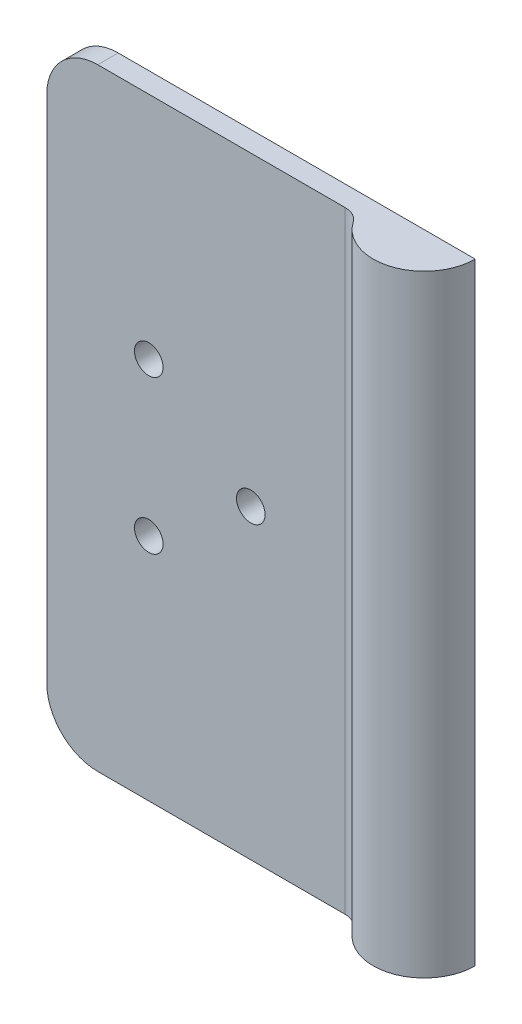
ISO-10303-21;
HEADER;
FILE_DESCRIPTION(('STEP AP214'),'2;1');
FILE_NAME('part.step','',(''),(''),'','','');
FILE_SCHEMA(('AUTOMOTIVE_DESIGN { 1 0 10303 214 1 1 1 1 }'));
ENDSEC;
DATA;
#1=APPLICATION_CONTEXT('core data for automotive mechanical design processes');
#2=APPLICATION_PROTOCOL_DEFINITION('international standard','automotive_design',2000,#1);
#3=PRODUCT_CONTEXT('',#1,'mechanical');
#4=PRODUCT('Part','Part','',(#3));
#5=PRODUCT_RELATED_PRODUCT_CATEGORY('part','',(#4));
#6=PRODUCT_DEFINITION_FORMATION('','',#4);
#7=PRODUCT_DEFINITION_CONTEXT('part definition',#1,'design');
#8=PRODUCT_DEFINITION('design','',#6,#7);
#9=PRODUCT_DEFINITION_SHAPE('','',#8);
#10=(LENGTH_UNIT() NAMED_UNIT(*) SI_UNIT(.MILLI.,.METRE.));
#11=(NAMED_UNIT(*) PLANE_ANGLE_UNIT() SI_UNIT($,.RADIAN.));
#12=(NAMED_UNIT(*) SI_UNIT($,.STERADIAN.) SOLID_ANGLE_UNIT());
#13=UNCERTAINTY_MEASURE_WITH_UNIT(LENGTH_MEASURE(1.E-05),#10,'distance_accuracy_value','');
#14=(GEOMETRIC_REPRESENTATION_CONTEXT(3) GLOBAL_UNCERTAINTY_ASSIGNED_CONTEXT((#13)) GLOBAL_UNIT_ASSIGNED_CONTEXT((#10,
#11,#12)) REPRESENTATION_CONTEXT('',''));
#15=CARTESIAN_POINT('',(0.,0.,0.));
#16=DIRECTION('',(0.,0.,1.));
#17=DIRECTION('',(1.,0.,0.));
#18=AXIS2_PLACEMENT_3D('',#15,#16,#17);
#19=CARTESIAN_POINT('',(-60.9850692997892,21.8064344030394,0.));
#20=DIRECTION('',(0.,0.,-1.));
#21=DIRECTION('',(-1.,0.,0.));
#22=AXIS2_PLACEMENT_3D('',#19,#20,#21);
#23=PLANE('',#22);
#24=CARTESIAN_POINT('',(-55.9850692997892,4.30643440303937,0.));
#25=DIRECTION('',(0.,0.,-1.));
#26=DIRECTION('',(1.,0.,0.));
#27=AXIS2_PLACEMENT_3D('',#24,#25,#26);
#28=CIRCLE('',#27,1.4);
#29=CARTESIAN_POINT('',(-54.5850692997892,4.30643440303937,0.));
#30=VERTEX_POINT('',#29);
#31=EDGE_CURVE('E159',#30,#30,#28,.T.);
#32=ORIENTED_EDGE('',*,*,#31,.T.);
#33=EDGE_LOOP('',(#32));
#34=FACE_BOUND('',#33,.T.);
#35=CARTESIAN_POINT('',(-55.9850692997892,-10.6935655969606,0.));
#36=DIRECTION('',(0.,0.,-1.));
#37=DIRECTION('',(1.,0.,0.));
#38=AXIS2_PLACEMENT_3D('',#35,#36,#37);
#39=CIRCLE('',#38,1.4);
#40=CARTESIAN_POINT('',(-54.5850692997892,-10.6935655969606,0.));
#41=VERTEX_POINT('',#40);
#42=EDGE_CURVE('E167',#41,#41,#39,.T.);
#43=ORIENTED_EDGE('',*,*,#42,.T.);
#44=EDGE_LOOP('',(#43));
#45=FACE_BOUND('',#44,.T.);
#46=CARTESIAN_POINT('',(-45.9850692997892,-3.19356559696063,0.));
#47=DIRECTION('',(0.,0.,-1.));
#48=DIRECTION('',(1.,0.,0.));
#49=AXIS2_PLACEMENT_3D('',#46,#47,#48);
#50=CIRCLE('',#49,1.4);
#51=CARTESIAN_POINT('',(-44.5850692997892,-3.19356559696063,0.));
#52=VERTEX_POINT('',#51);
#53=EDGE_CURVE('E172',#52,#52,#50,.T.);
#54=ORIENTED_EDGE('',*,*,#53,.T.);
#55=EDGE_LOOP('',(#54));
#56=FACE_BOUND('',#55,.T.);
#57=DIRECTION('',(-1.,0.,0.));
#58=VECTOR('',#57,1.);
#59=CARTESIAN_POINT('',(-30.9850692997892,-33.1935655969606,0.));
#60=LINE('',#59,#58);
#61=CARTESIAN_POINT('',(-36.7296319463273,-33.1935655969606,0.));
#62=VERTEX_POINT('',#61);
#63=CARTESIAN_POINT('',(-60.9850692997892,-33.1935655969606,0.));
#64=VERTEX_POINT('',#63);
#65=EDGE_CURVE('E145',#62,#64,#60,.T.);
#66=ORIENTED_EDGE('',*,*,#65,.F.);
#67=DIRECTION('',(0.,1.,0.));
#68=VECTOR('',#67,1.);
#69=CARTESIAN_POINT('',(-36.7296319463273,21.8064344030394,0.));
#70=LINE('',#69,#68);
#71=CARTESIAN_POINT('',(-36.7296319463273,26.8064344030394,0.));
#72=VERTEX_POINT('',#71);
#73=EDGE_CURVE('E128',#62,#72,#70,.T.);
#74=ORIENTED_EDGE('',*,*,#73,.T.);
#75=DIRECTION('',(1.,0.,0.));
#76=VECTOR('',#75,1.);
#77=CARTESIAN_POINT('',(-60.9850692997892,26.8064344030394,0.));
#78=LINE('',#77,#76);
#79=CARTESIAN_POINT('',(-60.9850692997892,26.8064344030394,0.));
#80=VERTEX_POINT('',#79);
#81=EDGE_CURVE('E142',#80,#72,#78,.T.);
#82=ORIENTED_EDGE('',*,*,#81,.F.);
#83=CARTESIAN_POINT('',(-60.9850692997892,21.8064344030394,0.));
#84=DIRECTION('',(0.,0.,-1.));
#85=DIRECTION('',(-1.,0.,0.));
#86=AXIS2_PLACEMENT_3D('',#83,#84,#85);
#87=CIRCLE('',#86,5.);
#88=CARTESIAN_POINT('',(-65.9850692997892,21.8064344030394,0.));
#89=VERTEX_POINT('',#88);
#90=EDGE_CURVE('E125',#89,#80,#87,.T.);
#91=ORIENTED_EDGE('',*,*,#90,.F.);
#92=DIRECTION('',(0.,1.,0.));
#93=VECTOR('',#92,1.);
#94=CARTESIAN_POINT('',(-65.9850692997892,-28.1935655969607,0.));
#95=LINE('',#94,#93);
#96=CARTESIAN_POINT('',(-65.9850692997892,-28.1935655969607,0.));
#97=VERTEX_POINT('',#96);
#98=EDGE_CURVE('E134',#97,#89,#95,.T.);
#99=ORIENTED_EDGE('',*,*,#98,.F.);
#100=CARTESIAN_POINT('',(-60.9850692997892,-28.1935655969607,0.));
#101=DIRECTION('',(0.,0.,-1.));
#102=DIRECTION('',(-1.,0.,0.));
#103=AXIS2_PLACEMENT_3D('',#100,#101,#102);
#104=CIRCLE('',#103,5.);
#105=EDGE_CURVE('E149',#64,#97,#104,.T.);
#106=ORIENTED_EDGE('',*,*,#105,.F.);
#107=EDGE_LOOP('',(#66,#74,#82,#91,#99,#106));
#108=FACE_BOUND('',#107,.T.);
#109=ADVANCED_FACE('F37',(#34,#45,#56,#108),#23,.F.);
#110=CARTESIAN_POINT('',(-60.9850692997892,21.8064344030394,0.));
#111=DIRECTION('',(0.,0.,-1.));
#112=DIRECTION('',(-1.,0.,0.));
#113=AXIS2_PLACEMENT_3D('',#110,#111,#112);
#114=CYLINDRICAL_SURFACE('',#113,5.);
#115=CARTESIAN_POINT('',(-60.9850692997892,21.8064344030394,-2.));
#116=DIRECTION('',(0.,0.,-1.));
#117=DIRECTION('',(-1.,0.,0.));
#118=AXIS2_PLACEMENT_3D('',#115,#116,#117);
#119=CIRCLE('',#118,5.);
#120=CARTESIAN_POINT('',(-65.9850692997892,21.8064344030394,-2.));
#121=VERTEX_POINT('',#120);
#122=CARTESIAN_POINT('',(-60.9850692997892,26.8064344030394,-2.));
#123=VERTEX_POINT('',#122);
#124=EDGE_CURVE('E158',#121,#123,#119,.T.);
#125=ORIENTED_EDGE('',*,*,#124,.F.);
#126=DIRECTION('',(0.,0.,-1.));
#127=VECTOR('',#126,1.);
#128=CARTESIAN_POINT('',(-65.9850692997892,21.8064344030394,0.));
#129=LINE('',#128,#127);
#130=EDGE_CURVE('E126',#89,#121,#129,.T.);
#131=ORIENTED_EDGE('',*,*,#130,.F.);
#132=ORIENTED_EDGE('',*,*,#90,.T.);
#133=DIRECTION('',(0.,0.,-1.));
#134=VECTOR('',#133,1.);
#135=CARTESIAN_POINT('',(-60.9850692997892,26.8064344030394,0.));
#136=LINE('',#135,#134);
#137=EDGE_CURVE('E132',#80,#123,#136,.T.);
#138=ORIENTED_EDGE('',*,*,#137,.T.);
#139=EDGE_LOOP('',(#125,#131,#132,#138));
#140=FACE_BOUND('',#139,.T.);
#141=ADVANCED_FACE('F186',(#140),#114,.T.);
#142=CARTESIAN_POINT('',(-65.9850692997892,-28.1935655969607,0.));
#143=DIRECTION('',(-1.,0.,0.));
#144=DIRECTION('',(0.,0.,1.));
#145=AXIS2_PLACEMENT_3D('',#142,#143,#144);
#146=PLANE('',#145);
#147=DIRECTION('',(0.,1.,0.));
#148=VECTOR('',#147,1.);
#149=CARTESIAN_POINT('',(-65.9850692997892,-28.1935655969607,-2.));
#150=LINE('',#149,#148);
#151=CARTESIAN_POINT('',(-65.9850692997892,-28.1935655969607,-2.));
#152=VERTEX_POINT('',#151);
#153=EDGE_CURVE('E119',#152,#121,#150,.T.);
#154=ORIENTED_EDGE('',*,*,#153,.F.);
#155=DIRECTION('',(0.,0.,-1.));
#156=VECTOR('',#155,1.);
#157=CARTESIAN_POINT('',(-65.9850692997892,-28.1935655969607,0.));
#158=LINE('',#157,#156);
#159=EDGE_CURVE('E129',#97,#152,#158,.T.);
#160=ORIENTED_EDGE('',*,*,#159,.F.);
#161=ORIENTED_EDGE('',*,*,#98,.T.);
#162=ORIENTED_EDGE('',*,*,#130,.T.);
#163=EDGE_LOOP('',(#154,#160,#161,#162));
#164=FACE_BOUND('',#163,.T.);
#165=ADVANCED_FACE('F184',(#164),#146,.T.);
#166=CARTESIAN_POINT('',(-60.9850692997892,-28.1935655969607,0.));
#167=DIRECTION('',(0.,0.,-1.));
#168=DIRECTION('',(-1.,0.,0.));
#169=AXIS2_PLACEMENT_3D('',#166,#167,#168);
#170=CYLINDRICAL_SURFACE('',#169,5.);
#171=CARTESIAN_POINT('',(-60.9850692997892,-28.1935655969607,-2.));
#172=DIRECTION('',(0.,0.,-1.));
#173=DIRECTION('',(-1.,0.,0.));
#174=AXIS2_PLACEMENT_3D('',#171,#172,#173);
#175=CIRCLE('',#174,5.);
#176=CARTESIAN_POINT('',(-60.9850692997892,-33.1935655969606,-2.));
#177=VERTEX_POINT('',#176);
#178=EDGE_CURVE('E117',#177,#152,#175,.T.);
#179=ORIENTED_EDGE('',*,*,#178,.F.);
#180=DIRECTION('',(0.,0.,-1.));
#181=VECTOR('',#180,1.);
#182=CARTESIAN_POINT('',(-60.9850692997892,-33.1935655969606,0.));
#183=LINE('',#182,#181);
#184=EDGE_CURVE('E115',#64,#177,#183,.T.);
#185=ORIENTED_EDGE('',*,*,#184,.F.);
#186=ORIENTED_EDGE('',*,*,#105,.T.);
#187=ORIENTED_EDGE('',*,*,#159,.T.);
#188=EDGE_LOOP('',(#179,#185,#186,#187));
#189=FACE_BOUND('',#188,.T.);
#190=ADVANCED_FACE('F180',(#189),#170,.T.);
#191=CARTESIAN_POINT('',(-30.9850692997892,-33.1935655969606,0.));
#192=DIRECTION('',(0.,-1.,0.));
#193=DIRECTION('',(0.,0.,-1.));
#194=AXIS2_PLACEMENT_3D('',#191,#192,#193);
#195=PLANE('',#194);
#196=ORIENTED_EDGE('',*,*,#184,.T.);
#197=DIRECTION('',(-1.,0.,0.));
#198=VECTOR('',#197,1.);
#199=CARTESIAN_POINT('',(-30.9850692997892,-33.1935655969606,-2.));
#200=LINE('',#199,#198);
#201=CARTESIAN_POINT('',(-25.9850692997892,-33.1935655969607,-2.));
#202=VERTEX_POINT('',#201);
#203=EDGE_CURVE('E107',#202,#177,#200,.T.);
#204=ORIENTED_EDGE('',*,*,#203,.F.);
#205=CARTESIAN_POINT('',(-30.9850692997892,-33.1935655969607,-2.));
#206=DIRECTION('',(0.,1.,0.));
#207=DIRECTION('',(0.,0.,1.));
#208=AXIS2_PLACEMENT_3D('',#205,#206,#207);
#209=CIRCLE('',#208,5.);
#210=CARTESIAN_POINT('',(-35.0883283330307,-33.1935655969607,0.857142857142855));
#211=VERTEX_POINT('',#210);
#212=EDGE_CURVE('E92',#211,#202,#209,.T.);
#213=ORIENTED_EDGE('',*,*,#212,.F.);
#214=CARTESIAN_POINT('',(-36.7296319463273,-33.1935655969606,2.));
#215=DIRECTION('',(0.,-1.,0.));
#216=DIRECTION('',(0.,0.,-1.));
#217=AXIS2_PLACEMENT_3D('',#214,#215,#216);
#218=CIRCLE('',#217,2.);
#219=EDGE_CURVE('E11',#211,#62,#218,.F.);
#220=ORIENTED_EDGE('',*,*,#219,.T.);
#221=ORIENTED_EDGE('',*,*,#65,.T.);
#222=EDGE_LOOP('',(#196,#204,#213,#220,#221));
#223=FACE_BOUND('',#222,.T.);
#224=ADVANCED_FACE('F113',(#223),#195,.T.);
#225=CARTESIAN_POINT('',(-60.9850692997892,26.8064344030394,0.));
#226=DIRECTION('',(0.,1.,0.));
#227=DIRECTION('',(0.,0.,1.));
#228=AXIS2_PLACEMENT_3D('',#225,#226,#227);
#229=PLANE('',#228);
#230=ORIENTED_EDGE('',*,*,#81,.T.);
#231=CARTESIAN_POINT('',(-36.7296319463273,26.8064344030394,2.));
#232=DIRECTION('',(0.,1.,0.));
#233=DIRECTION('',(0.,0.,1.));
#234=AXIS2_PLACEMENT_3D('',#231,#232,#233);
#235=CIRCLE('',#234,2.);
#236=CARTESIAN_POINT('',(-35.0883283330307,26.8064344030394,0.857142857142855));
#237=VERTEX_POINT('',#236);
#238=EDGE_CURVE('E45',#72,#237,#235,.F.);
#239=ORIENTED_EDGE('',*,*,#238,.T.);
#240=CARTESIAN_POINT('',(-30.9850692997892,26.8064344030394,-2.));
#241=DIRECTION('',(0.,1.,0.));
#242=DIRECTION('',(0.,0.,1.));
#243=AXIS2_PLACEMENT_3D('',#240,#241,#242);
#244=CIRCLE('',#243,5.);
#245=CARTESIAN_POINT('',(-25.9850692997892,26.8064344030394,-2.));
#246=VERTEX_POINT('',#245);
#247=EDGE_CURVE('E101',#237,#246,#244,.T.);
#248=ORIENTED_EDGE('',*,*,#247,.T.);
#249=DIRECTION('',(1.,0.,0.));
#250=VECTOR('',#249,1.);
#251=CARTESIAN_POINT('',(-60.9850692997892,26.8064344030394,-2.));
#252=LINE('',#251,#250);
#253=EDGE_CURVE('E111',#123,#246,#252,.T.);
#254=ORIENTED_EDGE('',*,*,#253,.F.);
#255=ORIENTED_EDGE('',*,*,#137,.F.);
#256=EDGE_LOOP('',(#230,#239,#248,#254,#255));
#257=FACE_BOUND('',#256,.T.);
#258=ADVANCED_FACE('F147',(#257),#229,.T.);
#259=CARTESIAN_POINT('',(-60.9850692997892,21.8064344030394,-2.));
#260=DIRECTION('',(0.,0.,-1.));
#261=DIRECTION('',(-1.,0.,0.));
#262=AXIS2_PLACEMENT_3D('',#259,#260,#261);
#263=PLANE('',#262);
#264=ORIENTED_EDGE('',*,*,#253,.T.);
#265=DIRECTION('',(0.,-1.,0.));
#266=VECTOR('',#265,1.);
#267=CARTESIAN_POINT('',(-25.9850692997892,21.8064344030394,-2.));
#268=LINE('',#267,#266);
#269=EDGE_CURVE('E95',#246,#202,#268,.T.);
#270=ORIENTED_EDGE('',*,*,#269,.T.);
#271=ORIENTED_EDGE('',*,*,#203,.T.);
#272=ORIENTED_EDGE('',*,*,#178,.T.);
#273=ORIENTED_EDGE('',*,*,#153,.T.);
#274=ORIENTED_EDGE('',*,*,#124,.T.);
#275=EDGE_LOOP('',(#264,#270,#271,#272,#273,#274));
#276=FACE_BOUND('',#275,.T.);
#277=CARTESIAN_POINT('',(-45.9850692997892,-3.19356559696063,-2.));
#278=DIRECTION('',(0.,0.,-1.));
#279=DIRECTION('',(1.,0.,0.));
#280=AXIS2_PLACEMENT_3D('',#277,#278,#279);
#281=CIRCLE('',#280,1.4);
#282=CARTESIAN_POINT('',(-44.5850692997892,-3.19356559696063,-2.));
#283=VERTEX_POINT('',#282);
#284=EDGE_CURVE('E100',#283,#283,#281,.T.);
#285=ORIENTED_EDGE('',*,*,#284,.F.);
#286=EDGE_LOOP('',(#285));
#287=FACE_BOUND('',#286,.T.);
#288=CARTESIAN_POINT('',(-55.9850692997892,-10.6935655969606,-2.));
#289=DIRECTION('',(0.,0.,-1.));
#290=DIRECTION('',(1.,0.,0.));
#291=AXIS2_PLACEMENT_3D('',#288,#289,#290);
#292=CIRCLE('',#291,1.4);
#293=CARTESIAN_POINT('',(-54.5850692997892,-10.6935655969606,-2.));
#294=VERTEX_POINT('',#293);
#295=EDGE_CURVE('E169',#294,#294,#292,.T.);
#296=ORIENTED_EDGE('',*,*,#295,.F.);
#297=EDGE_LOOP('',(#296));
#298=FACE_BOUND('',#297,.T.);
#299=CARTESIAN_POINT('',(-55.9850692997892,4.30643440303937,-2.));
#300=DIRECTION('',(0.,0.,-1.));
#301=DIRECTION('',(1.,0.,0.));
#302=AXIS2_PLACEMENT_3D('',#299,#300,#301);
#303=CIRCLE('',#302,1.4);
#304=CARTESIAN_POINT('',(-54.5850692997892,4.30643440303937,-2.));
#305=VERTEX_POINT('',#304);
#306=EDGE_CURVE('E162',#305,#305,#303,.T.);
#307=ORIENTED_EDGE('',*,*,#306,.F.);
#308=EDGE_LOOP('',(#307));
#309=FACE_BOUND('',#308,.T.);
#310=ADVANCED_FACE('F104',(#276,#287,#298,#309),#263,.T.);
#311=CARTESIAN_POINT('',(-55.9850692997892,4.30643440303937,0.));
#312=DIRECTION('',(0.,0.,-1.));
#313=DIRECTION('',(-1.,0.,0.));
#314=AXIS2_PLACEMENT_3D('',#311,#312,#313);
#315=CYLINDRICAL_SURFACE('',#314,1.4);
#316=ORIENTED_EDGE('',*,*,#31,.F.);
#317=EDGE_LOOP('',(#316));
#318=FACE_BOUND('',#317,.T.);
#319=ORIENTED_EDGE('',*,*,#306,.T.);
#320=EDGE_LOOP('',(#319));
#321=FACE_BOUND('',#320,.T.);
#322=ADVANCED_FACE('F202',(#318,#321),#315,.F.);
#323=CARTESIAN_POINT('',(-55.9850692997892,-10.6935655969606,0.));
#324=DIRECTION('',(0.,0.,-1.));
#325=DIRECTION('',(-1.,0.,0.));
#326=AXIS2_PLACEMENT_3D('',#323,#324,#325);
#327=CYLINDRICAL_SURFACE('',#326,1.4);
#328=ORIENTED_EDGE('',*,*,#42,.F.);
#329=EDGE_LOOP('',(#328));
#330=FACE_BOUND('',#329,.T.);
#331=ORIENTED_EDGE('',*,*,#295,.T.);
#332=EDGE_LOOP('',(#331));
#333=FACE_BOUND('',#332,.T.);
#334=ADVANCED_FACE('F206',(#330,#333),#327,.F.);
#335=CARTESIAN_POINT('',(-45.9850692997892,-3.19356559696063,0.));
#336=DIRECTION('',(0.,0.,-1.));
#337=DIRECTION('',(-1.,0.,0.));
#338=AXIS2_PLACEMENT_3D('',#335,#336,#337);
#339=CYLINDRICAL_SURFACE('',#338,1.4);
#340=ORIENTED_EDGE('',*,*,#53,.F.);
#341=EDGE_LOOP('',(#340));
#342=FACE_BOUND('',#341,.T.);
#343=ORIENTED_EDGE('',*,*,#284,.T.);
#344=EDGE_LOOP('',(#343));
#345=FACE_BOUND('',#344,.T.);
#346=ADVANCED_FACE('F210',(#342,#345),#339,.F.);
#347=CARTESIAN_POINT('',(-30.9850692997892,-33.1935655969607,-2.));
#348=DIRECTION('',(0.,1.,0.));
#349=DIRECTION('',(0.,0.,1.));
#350=AXIS2_PLACEMENT_3D('',#347,#348,#349);
#351=CYLINDRICAL_SURFACE('',#350,5.);
#352=ORIENTED_EDGE('',*,*,#247,.F.);
#353=DIRECTION('',(0.,1.,0.));
#354=VECTOR('',#353,1.);
#355=CARTESIAN_POINT('',(-35.0883283330307,-33.1935655969607,0.857142857142856));
#356=LINE('',#355,#354);
#357=EDGE_CURVE('E52',#237,#211,#356,.F.);
#358=ORIENTED_EDGE('',*,*,#357,.T.);
#359=ORIENTED_EDGE('',*,*,#212,.T.);
#360=ORIENTED_EDGE('',*,*,#269,.F.);
#361=EDGE_LOOP('',(#352,#358,#359,#360));
#362=FACE_BOUND('',#361,.T.);
#363=ADVANCED_FACE('F94',(#362),#351,.T.);
#364=CARTESIAN_POINT('',(-36.7296319463273,-33.1935655969607,2.));
#365=DIRECTION('',(0.,1.,0.));
#366=DIRECTION('',(0.,0.,1.));
#367=AXIS2_PLACEMENT_3D('',#364,#365,#366);
#368=CYLINDRICAL_SURFACE('',#367,2.);
#369=ORIENTED_EDGE('',*,*,#219,.F.);
#370=ORIENTED_EDGE('',*,*,#357,.F.);
#371=ORIENTED_EDGE('',*,*,#238,.F.);
#372=ORIENTED_EDGE('',*,*,#73,.F.);
#373=EDGE_LOOP('',(#369,#370,#371,#372));
#374=FACE_BOUND('',#373,.T.);
#375=ADVANCED_FACE('F39',(#374),#368,.F.);
#376=CLOSED_SHELL('',(#109,#141,#165,#190,#224,#258,#310,#322,#334,#346,#363,#375));
#377=MANIFOLD_SOLID_BREP('B2',#376);
#378=ADVANCED_BREP_SHAPE_REPRESENTATION('',(#18,#377),#14);
#379=SHAPE_DEFINITION_REPRESENTATION(#9,#378);
ENDSEC;
END-ISO-10303-21;
